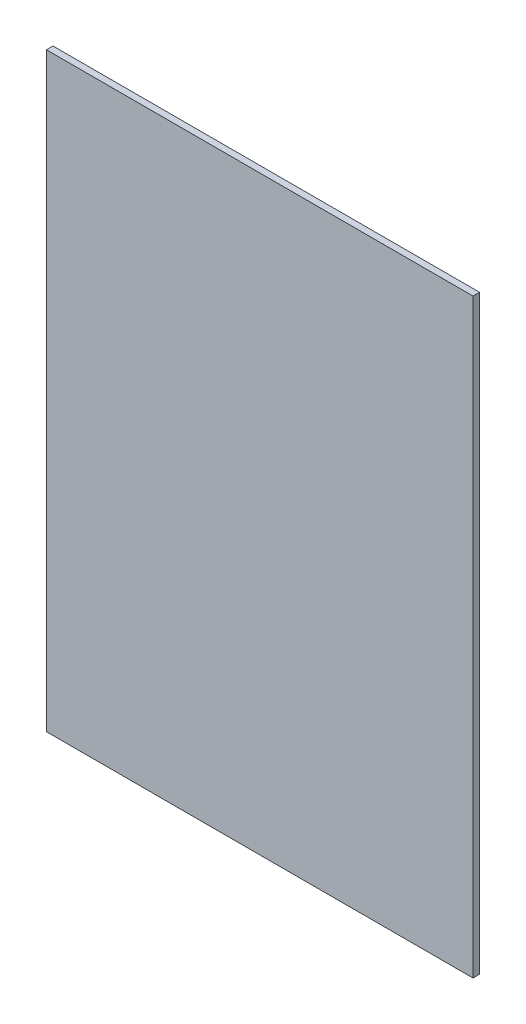
ISO-10303-21;
HEADER;
FILE_DESCRIPTION(('STEP AP214'),'2;1');
FILE_NAME('part.step','',(''),(''),'','','');
FILE_SCHEMA(('AUTOMOTIVE_DESIGN { 1 0 10303 214 1 1 1 1 }'));
ENDSEC;
DATA;
#1=APPLICATION_CONTEXT('core data for automotive mechanical design processes');
#2=APPLICATION_PROTOCOL_DEFINITION('international standard','automotive_design',2000,#1);
#3=PRODUCT_CONTEXT('',#1,'mechanical');
#4=PRODUCT('Part','Part','',(#3));
#5=PRODUCT_RELATED_PRODUCT_CATEGORY('part','',(#4));
#6=PRODUCT_DEFINITION_FORMATION('','',#4);
#7=PRODUCT_DEFINITION_CONTEXT('part definition',#1,'design');
#8=PRODUCT_DEFINITION('design','',#6,#7);
#9=PRODUCT_DEFINITION_SHAPE('','',#8);
#10=(LENGTH_UNIT() NAMED_UNIT(*) SI_UNIT(.MILLI.,.METRE.));
#11=(NAMED_UNIT(*) PLANE_ANGLE_UNIT() SI_UNIT($,.RADIAN.));
#12=(NAMED_UNIT(*) SI_UNIT($,.STERADIAN.) SOLID_ANGLE_UNIT());
#13=UNCERTAINTY_MEASURE_WITH_UNIT(LENGTH_MEASURE(1.E-05),#10,'distance_accuracy_value','');
#14=(GEOMETRIC_REPRESENTATION_CONTEXT(3) GLOBAL_UNCERTAINTY_ASSIGNED_CONTEXT((#13)) GLOBAL_UNIT_ASSIGNED_CONTEXT((#10,
#11,#12)) REPRESENTATION_CONTEXT('',''));
#15=CARTESIAN_POINT('',(0.,0.,0.));
#16=DIRECTION('',(0.,0.,1.));
#17=DIRECTION('',(1.,0.,0.));
#18=AXIS2_PLACEMENT_3D('',#15,#16,#17);
#19=CARTESIAN_POINT('',(49.781032387222,14.166002886121,0.01));
#20=DIRECTION('',(-0.999999999999985,-1.74845553240898E-07,0.));
#21=DIRECTION('',(-1.74845553240898E-07,0.999999999999985,0.));
#22=AXIS2_PLACEMENT_3D('',#19,#20,#21);
#23=PLANE('',#22);
#24=DIRECTION('',(1.74845552999998E-07,-0.999999999999985,0.));
#25=VECTOR('',#24,1.);
#26=CARTESIAN_POINT('',(49.781032387222,14.166002886121,-0.01));
#27=LINE('',#26,#25);
#28=CARTESIAN_POINT('',(49.781032387222,14.166002886121,-0.01));
#29=VERTEX_POINT('',#28);
#30=CARTESIAN_POINT('',(49.781032701944,12.366002886121,-0.01));
#31=VERTEX_POINT('',#30);
#32=EDGE_CURVE('E11',#29,#31,#27,.T.);
#33=ORIENTED_EDGE('',*,*,#32,.F.);
#34=DIRECTION('',(0.,0.,1.));
#35=VECTOR('',#34,1.);
#36=CARTESIAN_POINT('',(49.781032387222,14.166002886121,-0.01));
#37=LINE('',#36,#35);
#38=CARTESIAN_POINT('',(49.781032387222,14.166002886121,0.01));
#39=VERTEX_POINT('',#38);
#40=EDGE_CURVE('E28',#29,#39,#37,.T.);
#41=ORIENTED_EDGE('',*,*,#40,.T.);
#42=DIRECTION('',(1.74845553246698E-07,-0.999999999999985,0.));
#43=VECTOR('',#42,1.);
#44=CARTESIAN_POINT('',(49.781032387222,14.166002886121,0.01));
#45=LINE('',#44,#43);
#46=CARTESIAN_POINT('',(49.781032701944,12.366002886121,0.01));
#47=VERTEX_POINT('',#46);
#48=EDGE_CURVE('E64',#39,#47,#45,.T.);
#49=ORIENTED_EDGE('',*,*,#48,.T.);
#50=DIRECTION('',(0.,0.,1.));
#51=VECTOR('',#50,1.);
#52=CARTESIAN_POINT('',(49.781032701944,12.366002886121,-0.01));
#53=LINE('',#52,#51);
#54=EDGE_CURVE('E67',#31,#47,#53,.T.);
#55=ORIENTED_EDGE('',*,*,#54,.F.);
#56=EDGE_LOOP('',(#33,#41,#49,#55));
#57=FACE_BOUND('',#56,.T.);
#58=ADVANCED_FACE('F17',(#57),#23,.F.);
#59=CARTESIAN_POINT('',(49.781032701944,12.366002886121,-0.01));
#60=DIRECTION('',(0.,0.,1.));
#61=DIRECTION('',(1.,0.,0.));
#62=AXIS2_PLACEMENT_3D('',#59,#60,#61);
#63=PLANE('',#62);
#64=ORIENTED_EDGE('',*,*,#32,.T.);
#65=DIRECTION('',(-0.999999999999985,-1.74845552999998E-07,0.));
#66=VECTOR('',#65,1.);
#67=CARTESIAN_POINT('',(49.781032701944,12.366002886121,-0.01));
#68=LINE('',#67,#66);
#69=CARTESIAN_POINT('',(48.481032701944,12.366002658821,-0.01));
#70=VERTEX_POINT('',#69);
#71=EDGE_CURVE('E21',#31,#70,#68,.T.);
#72=ORIENTED_EDGE('',*,*,#71,.T.);
#73=DIRECTION('',(-1.74845552999998E-07,0.999999999999985,0.));
#74=VECTOR('',#73,1.);
#75=CARTESIAN_POINT('',(48.481032701944,12.366002658821,-0.01));
#76=LINE('',#75,#74);
#77=CARTESIAN_POINT('',(48.481032387222,14.166002658821,-0.01));
#78=VERTEX_POINT('',#77);
#79=EDGE_CURVE('E101',#70,#78,#76,.T.);
#80=ORIENTED_EDGE('',*,*,#79,.T.);
#81=DIRECTION('',(0.999999999999985,1.74845552999998E-07,0.));
#82=VECTOR('',#81,1.);
#83=CARTESIAN_POINT('',(48.481032387222,14.166002658821,-0.01));
#84=LINE('',#83,#82);
#85=EDGE_CURVE('E105',#78,#29,#84,.T.);
#86=ORIENTED_EDGE('',*,*,#85,.T.);
#87=EDGE_LOOP('',(#64,#72,#80,#86));
#88=FACE_BOUND('',#87,.T.);
#89=ADVANCED_FACE('F143',(#88),#63,.F.);
#90=CARTESIAN_POINT('',(48.481032387222,14.166002658821,0.01));
#91=DIRECTION('',(1.74845552999998E-07,-0.999999999999985,0.));
#92=DIRECTION('',(0.,0.,-1.));
#93=AXIS2_PLACEMENT_3D('',#90,#91,#92);
#94=PLANE('',#93);
#95=ORIENTED_EDGE('',*,*,#85,.F.);
#96=DIRECTION('',(0.,0.,1.));
#97=VECTOR('',#96,1.);
#98=CARTESIAN_POINT('',(48.481032387222,14.166002658821,-0.01));
#99=LINE('',#98,#97);
#100=CARTESIAN_POINT('',(48.481032387222,14.166002658821,0.01));
#101=VERTEX_POINT('',#100);
#102=EDGE_CURVE('E91',#78,#101,#99,.T.);
#103=ORIENTED_EDGE('',*,*,#102,.T.);
#104=DIRECTION('',(0.999999999999985,1.74845552999998E-07,0.));
#105=VECTOR('',#104,1.);
#106=CARTESIAN_POINT('',(48.481032387222,14.166002658821,0.01));
#107=LINE('',#106,#105);
#108=EDGE_CURVE('E72',#101,#39,#107,.T.);
#109=ORIENTED_EDGE('',*,*,#108,.T.);
#110=ORIENTED_EDGE('',*,*,#40,.F.);
#111=EDGE_LOOP('',(#95,#103,#109,#110));
#112=FACE_BOUND('',#111,.T.);
#113=ADVANCED_FACE('F118',(#112),#94,.F.);
#114=CARTESIAN_POINT('',(49.781032701944,12.366002886121,0.01));
#115=DIRECTION('',(0.,0.,1.));
#116=DIRECTION('',(1.,0.,0.));
#117=AXIS2_PLACEMENT_3D('',#114,#115,#116);
#118=PLANE('',#117);
#119=ORIENTED_EDGE('',*,*,#48,.F.);
#120=ORIENTED_EDGE('',*,*,#108,.F.);
#121=DIRECTION('',(-1.74845552876598E-07,0.999999999999985,0.));
#122=VECTOR('',#121,1.);
#123=CARTESIAN_POINT('',(48.481032701944,12.366002658821,0.01));
#124=LINE('',#123,#122);
#125=CARTESIAN_POINT('',(48.481032701944,12.366002658821,0.01));
#126=VERTEX_POINT('',#125);
#127=EDGE_CURVE('E78',#126,#101,#124,.T.);
#128=ORIENTED_EDGE('',*,*,#127,.F.);
#129=DIRECTION('',(-0.999999999999985,-1.74845552999998E-07,0.));
#130=VECTOR('',#129,1.);
#131=CARTESIAN_POINT('',(49.781032701944,12.366002886121,0.01));
#132=LINE('',#131,#130);
#133=EDGE_CURVE('E73',#47,#126,#132,.T.);
#134=ORIENTED_EDGE('',*,*,#133,.F.);
#135=EDGE_LOOP('',(#119,#120,#128,#134));
#136=FACE_BOUND('',#135,.T.);
#137=ADVANCED_FACE('F76',(#136),#118,.T.);
#138=CARTESIAN_POINT('',(48.481032701944,12.366002658821,0.01));
#139=DIRECTION('',(-1.74845552999998E-07,0.999999999999985,0.));
#140=DIRECTION('',(0.,0.,1.));
#141=AXIS2_PLACEMENT_3D('',#138,#139,#140);
#142=PLANE('',#141);
#143=ORIENTED_EDGE('',*,*,#71,.F.);
#144=ORIENTED_EDGE('',*,*,#54,.T.);
#145=ORIENTED_EDGE('',*,*,#133,.T.);
#146=DIRECTION('',(0.,0.,1.));
#147=VECTOR('',#146,1.);
#148=CARTESIAN_POINT('',(48.481032701944,12.366002658821,-0.01));
#149=LINE('',#148,#147);
#150=EDGE_CURVE('E98',#70,#126,#149,.T.);
#151=ORIENTED_EDGE('',*,*,#150,.F.);
#152=EDGE_LOOP('',(#143,#144,#145,#151));
#153=FACE_BOUND('',#152,.T.);
#154=ADVANCED_FACE('F19',(#153),#142,.F.);
#155=CARTESIAN_POINT('',(48.481032387222,14.166002658821,0.01));
#156=DIRECTION('',(0.999999999999985,1.74845552879498E-07,0.));
#157=DIRECTION('',(0.,0.,-1.));
#158=AXIS2_PLACEMENT_3D('',#155,#156,#157);
#159=PLANE('',#158);
#160=ORIENTED_EDGE('',*,*,#79,.F.);
#161=ORIENTED_EDGE('',*,*,#150,.T.);
#162=ORIENTED_EDGE('',*,*,#127,.T.);
#163=ORIENTED_EDGE('',*,*,#102,.F.);
#164=EDGE_LOOP('',(#160,#161,#162,#163));
#165=FACE_BOUND('',#164,.T.);
#166=ADVANCED_FACE('F122',(#165),#159,.F.);
#167=CLOSED_SHELL('',(#58,#89,#113,#137,#154,#166));
#168=MANIFOLD_SOLID_BREP('B1',#167);
#169=ADVANCED_BREP_SHAPE_REPRESENTATION('',(#18,#168),#14);
#170=SHAPE_DEFINITION_REPRESENTATION(#9,#169);
ENDSEC;
END-ISO-10303-21;
